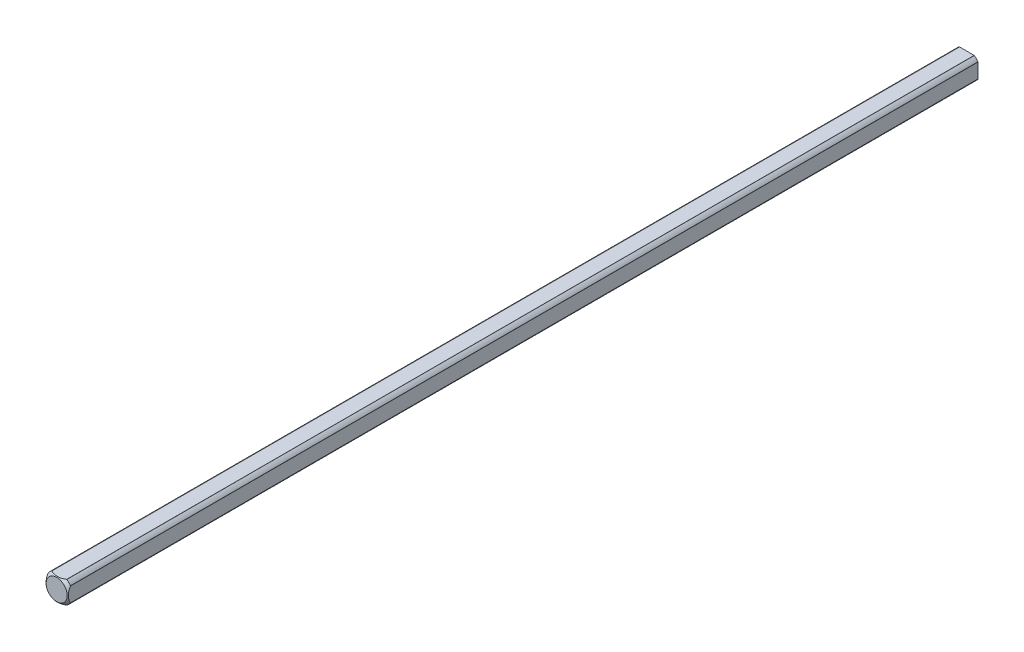
ISO-10303-21;
HEADER;
FILE_DESCRIPTION(('STEP AP214'),'2;1');
FILE_NAME('part.step','',(''),(''),'','','');
FILE_SCHEMA(('AUTOMOTIVE_DESIGN { 1 0 10303 214 1 1 1 1 }'));
ENDSEC;
DATA;
#1=APPLICATION_CONTEXT('core data for automotive mechanical design processes');
#2=APPLICATION_PROTOCOL_DEFINITION('international standard','automotive_design',2000,#1);
#3=PRODUCT_CONTEXT('',#1,'mechanical');
#4=PRODUCT('Part','Part','',(#3));
#5=PRODUCT_RELATED_PRODUCT_CATEGORY('part','',(#4));
#6=PRODUCT_DEFINITION_FORMATION('','',#4);
#7=PRODUCT_DEFINITION_CONTEXT('part definition',#1,'design');
#8=PRODUCT_DEFINITION('design','',#6,#7);
#9=PRODUCT_DEFINITION_SHAPE('','',#8);
#10=(LENGTH_UNIT() NAMED_UNIT(*) SI_UNIT(.MILLI.,.METRE.));
#11=(NAMED_UNIT(*) PLANE_ANGLE_UNIT() SI_UNIT($,.RADIAN.));
#12=(NAMED_UNIT(*) SI_UNIT($,.STERADIAN.) SOLID_ANGLE_UNIT());
#13=UNCERTAINTY_MEASURE_WITH_UNIT(LENGTH_MEASURE(1.E-05),#10,'distance_accuracy_value','');
#14=(GEOMETRIC_REPRESENTATION_CONTEXT(3) GLOBAL_UNCERTAINTY_ASSIGNED_CONTEXT((#13)) GLOBAL_UNIT_ASSIGNED_CONTEXT((#10,
#11,#12)) REPRESENTATION_CONTEXT('',''));
#15=CARTESIAN_POINT('',(0.,0.,0.));
#16=DIRECTION('',(0.,0.,1.));
#17=DIRECTION('',(1.,0.,0.));
#18=AXIS2_PLACEMENT_3D('',#15,#16,#17);
#19=CARTESIAN_POINT('',(28.7535475568245,43.3190804876236,256.196800890026));
#20=DIRECTION('',(0.,1.,0.));
#21=DIRECTION('',(1.,0.,0.));
#22=AXIS2_PLACEMENT_3D('',#19,#20,#21);
#23=SPHERICAL_SURFACE('',#22,5.);
#24=CARTESIAN_POINT('',(25.5785475568245,43.3190804876236,256.196800890026));
#25=DIRECTION('',(1.,0.,0.));
#26=DIRECTION('',(0.,0.,-1.));
#27=AXIS2_PLACEMENT_3D('',#24,#25,#26);
#28=CIRCLE('',#27,3.86256067913504);
#29=CARTESIAN_POINT('',(25.5785475568245,45.3864907033282,259.459497627389));
#30=VERTEX_POINT('',#29);
#31=CARTESIAN_POINT('',(25.5785475568245,43.3190804876236,260.059361569161));
#32=VERTEX_POINT('',#31);
#33=EDGE_CURVE('E51',#30,#32,#28,.T.);
#34=ORIENTED_EDGE('',*,*,#33,.T.);
#35=CARTESIAN_POINT('',(28.7535475568245,43.3190804876236,256.196800890026));
#36=DIRECTION('',(0.,1.,0.));
#37=DIRECTION('',(-1.,0.,0.));
#38=AXIS2_PLACEMENT_3D('',#35,#36,#37);
#39=CIRCLE('',#38,5.);
#40=CARTESIAN_POINT('',(25.7535475568245,43.3190804876236,260.196800890026));
#41=VERTEX_POINT('',#40);
#42=EDGE_CURVE('E71',#32,#41,#39,.T.);
#43=ORIENTED_EDGE('',*,*,#42,.T.);
#44=CARTESIAN_POINT('',(28.7535475568245,43.3190804876236,260.196800890026));
#45=DIRECTION('',(0.,0.,1.));
#46=DIRECTION('',(1.,0.,0.));
#47=AXIS2_PLACEMENT_3D('',#44,#45,#46);
#48=CIRCLE('',#47,3.);
#49=CARTESIAN_POINT('',(31.7535475568245,43.3190804876236,260.196800890026));
#50=VERTEX_POINT('',#49);
#51=EDGE_CURVE('E430',#50,#41,#48,.T.);
#52=ORIENTED_EDGE('',*,*,#51,.F.);
#53=CARTESIAN_POINT('',(28.7535475568245,43.3190804876236,256.196800890026));
#54=DIRECTION('',(0.,-1.,0.));
#55=DIRECTION('',(0.,0.,-1.));
#56=AXIS2_PLACEMENT_3D('',#53,#54,#55);
#57=CIRCLE('',#56,5.);
#58=CARTESIAN_POINT('',(31.9285475568245,43.3190804876236,260.059361569161));
#59=VERTEX_POINT('',#58);
#60=EDGE_CURVE('E236',#59,#50,#57,.T.);
#61=ORIENTED_EDGE('',*,*,#60,.F.);
#62=CARTESIAN_POINT('',(31.9285475568245,43.3190804876236,256.196800890026));
#63=DIRECTION('',(-1.,0.,0.));
#64=DIRECTION('',(0.,0.,1.));
#65=AXIS2_PLACEMENT_3D('',#62,#63,#64);
#66=CIRCLE('',#65,3.86256067913504);
#67=CARTESIAN_POINT('',(31.9285475568245,45.3864907033282,259.459497627389));
#68=VERTEX_POINT('',#67);
#69=EDGE_CURVE('E377',#59,#68,#66,.T.);
#70=ORIENTED_EDGE('',*,*,#69,.T.);
#71=CARTESIAN_POINT('',(31.9066510051003,45.4577807107663,259.434686002256));
#72=CARTESIAN_POINT('',(31.9075078005275,45.4565176724769,259.434685928989));
#73=CARTESIAN_POINT('',(31.9083416590292,45.4552391600304,259.434718472174));
#74=CARTESIAN_POINT('',(31.9099665116627,45.4526471764855,259.434847776251));
#75=CARTESIAN_POINT('',(31.9107572050904,45.4513335367559,259.434944937507));
#76=CARTESIAN_POINT('',(31.9122940546831,45.448672646835,259.435203454448));
#77=CARTESIAN_POINT('',(31.9130398065263,45.4473252124042,259.435365314641));
#78=CARTESIAN_POINT('',(31.9144852671077,45.4445981686378,259.435753105404));
#79=CARTESIAN_POINT('',(31.9151844664741,45.4432183747466,259.435979634748));
#80=CARTESIAN_POINT('',(31.9165353203589,45.4404281081938,259.436496678883));
#81=CARTESIAN_POINT('',(31.9171863604332,45.4390174650019,259.436787876514));
#82=CARTESIAN_POINT('',(31.9184394438435,45.436167064375,259.437434175205));
#83=CARTESIAN_POINT('',(31.9190407704591,45.434727163666,259.437790031756));
#84=CARTESIAN_POINT('',(31.9201930145184,45.4318198796802,259.438565580029));
#85=CARTESIAN_POINT('',(31.9207431177512,45.4303523921039,259.438986088167));
#86=CARTESIAN_POINT('',(31.921791547355,45.4273916345701,259.439890882635));
#87=CARTESIAN_POINT('',(31.9222889686091,45.425898309321,259.440376034533));
#88=CARTESIAN_POINT('',(31.9232307128414,45.4228876458044,259.44141007143));
#89=CARTESIAN_POINT('',(31.9236740477385,45.4213703095016,259.441959859738));
#90=CARTESIAN_POINT('',(31.9245063472057,45.4183134630802,259.443123135607));
#91=CARTESIAN_POINT('',(31.9248942496571,45.4167740186513,259.443737553436));
#92=CARTESIAN_POINT('',(31.925614464728,45.4136748655876,259.445030064964));
#93=CARTESIAN_POINT('',(31.9259456507314,45.4121152911381,259.445709105947));
#94=CARTESIAN_POINT('',(31.9265512695634,45.4089778576026,259.447130850375));
#95=CARTESIAN_POINT('',(31.9268245211068,45.4074002043924,259.447874509168));
#96=CARTESIAN_POINT('',(31.9273131678021,45.4042286648182,259.449425483091));
#97=CARTESIAN_POINT('',(31.9275273368391,45.4026350578618,259.450233753706));
#98=CARTESIAN_POINT('',(31.9278967794103,45.3994337251356,259.451913957764));
#99=CARTESIAN_POINT('',(31.9280507916219,45.397826352775,259.452786840106));
#100=CARTESIAN_POINT('',(31.9282989506169,45.3945996977676,259.454596261006));
#101=CARTESIAN_POINT('',(31.9283918101211,45.3929808426428,259.455533735711));
#102=CARTESIAN_POINT('',(31.9285167646294,45.3897333988621,259.457472415343));
#103=CARTESIAN_POINT('',(31.9285475550807,45.3881053085549,259.458474540453));
#104=CARTESIAN_POINT('',(31.9285475568245,45.3864907033282,259.459497627389));
#105=B_SPLINE_CURVE_WITH_KNOTS('',3,(#71,#72,#73,#74,#75,#76,#77,#78,#79,#80,#81,#82,#83,#84,
#85,#86,#87,#88,#89,#90,#91,#92,#93,#94,#95,#96,#97,#98,#99,#100,#101,#102,#103,#104),
.UNSPECIFIED.,.F.,.F.,(4,2,2,2,2,2,2,2,2,2,2,2,2,2,2,2,4),(0.,0.00457797688055672,
0.00918458579630476,0.0138278395700054,0.0185155631142393,0.0232553611013212,0.0280545906640062,
0.032920339355959,0.0378594083742456,0.0428783008509084,0.0479832148661545,0.0531800407238063,
0.0584743619609931,0.0638714595328926,0.0693763186141383,0.0749936374824722,0.0807278379924127),.UNSPECIFIED.);
#106=CARTESIAN_POINT('',(31.9066510051003,45.4577807107663,259.434686002256));
#107=VERTEX_POINT('',#106);
#108=EDGE_CURVE('E363',#107,#68,#105,.T.);
#109=ORIENTED_EDGE('',*,*,#108,.F.);
#110=CARTESIAN_POINT('',(28.7535475568245,43.3190804876236,259.434686002256));
#111=DIRECTION('',(0.,0.,1.));
#112=DIRECTION('',(-1.,0.,0.));
#113=AXIS2_PLACEMENT_3D('',#110,#111,#112);
#114=CIRCLE('',#113,3.81);
#115=CARTESIAN_POINT('',(30.8922477799672,46.4721839358994,259.434686002256));
#116=VERTEX_POINT('',#115);
#117=EDGE_CURVE('E372',#107,#116,#114,.T.);
#118=ORIENTED_EDGE('',*,*,#117,.T.);
#119=CARTESIAN_POINT('',(30.8209577725291,46.4940804876236,259.459497627389));
#120=CARTESIAN_POINT('',(30.8225723777558,46.4940804858798,259.458474540453));
#121=CARTESIAN_POINT('',(30.824200468063,46.4940496954285,259.457472415343));
#122=CARTESIAN_POINT('',(30.8274479118437,46.4939247409202,259.455533735711));
#123=CARTESIAN_POINT('',(30.8290667669686,46.493831881416,259.454596261006));
#124=CARTESIAN_POINT('',(30.832293421976,46.493583722421,259.452786840106));
#125=CARTESIAN_POINT('',(30.8339007943366,46.4934297102094,259.451913957764));
#126=CARTESIAN_POINT('',(30.8371021270628,46.4930602676382,259.450233753706));
#127=CARTESIAN_POINT('',(30.8386957340192,46.4928460986012,259.449425483091));
#128=CARTESIAN_POINT('',(30.8418672735935,46.4923574519059,259.447874509168));
#129=CARTESIAN_POINT('',(30.8434449268037,46.4920842003625,259.447130850375));
#130=CARTESIAN_POINT('',(30.8465823603392,46.4914785815305,259.445709105947));
#131=CARTESIAN_POINT('',(30.8481419347887,46.4911473955271,259.445030064964));
#132=CARTESIAN_POINT('',(30.8512410878524,46.4904271804562,259.443737553436));
#133=CARTESIAN_POINT('',(30.8527805322813,46.4900392780048,259.443123135607));
#134=CARTESIAN_POINT('',(30.8558373787027,46.4892069785376,259.441959859738));
#135=CARTESIAN_POINT('',(30.8573547150055,46.4887636436404,259.44141007143));
#136=CARTESIAN_POINT('',(30.8603653785221,46.4878218994081,259.440376034533));
#137=CARTESIAN_POINT('',(30.8618587037712,46.4873244781541,259.439890882635));
#138=CARTESIAN_POINT('',(30.864819461305,46.4862760485502,259.438986088167));
#139=CARTESIAN_POINT('',(30.8662869488813,46.4857259453174,259.438565580029));
#140=CARTESIAN_POINT('',(30.8691942328671,46.4845737012581,259.437790031756));
#141=CARTESIAN_POINT('',(30.870634133576,46.4839723746426,259.437434175205));
#142=CARTESIAN_POINT('',(30.8734845342029,46.4827192912322,259.436787876514));
#143=CARTESIAN_POINT('',(30.8748951773948,46.4820682511579,259.436496678883));
#144=CARTESIAN_POINT('',(30.8776854439476,46.4807173972732,259.435979634748));
#145=CARTESIAN_POINT('',(30.8790652378388,46.4800181979067,259.435753105404));
#146=CARTESIAN_POINT('',(30.8817922816052,46.4785727373254,259.435365314641));
#147=CARTESIAN_POINT('',(30.883139716036,46.4778269854821,259.435203454448));
#148=CARTESIAN_POINT('',(30.8858006059569,46.4762901358895,259.434944937507));
#149=CARTESIAN_POINT('',(30.8871142456865,46.4754994424618,259.434847776251));
#150=CARTESIAN_POINT('',(30.8897062292313,46.4738745898283,259.434718472174));
#151=CARTESIAN_POINT('',(30.8909847416778,46.4730407313266,259.434685928989));
#152=CARTESIAN_POINT('',(30.8922477799672,46.4721839358994,259.434686002256));
#153=B_SPLINE_CURVE_WITH_KNOTS('',3,(#119,#120,#121,#122,#123,#124,#125,#126,#127,#128,#129,
#130,#131,#132,#133,#134,#135,#136,#137,#138,#139,#140,#141,#142,#143,#144,#145,#146,#147,#148,
#149,#150,#151,#152),.UNSPECIFIED.,.F.,.F.,(4,2,2,2,2,2,2,2,2,2,2,2,2,2,2,2,4),(0.,
0.00573420050998488,0.0113515193783518,0.0168563784596285,0.0222534760315572,0.0275477972687607,
0.0327446231264275,0.0378495371416878,0.0428684296183512,0.0478074986366314,0.0526732473285772,
0.0574724768912435,0.0622122748783008,0.0668999984225071,0.0715432521961739,0.0761498611118691,
0.0807278379923825),.UNSPECIFIED.);
#154=CARTESIAN_POINT('',(30.8209577725291,46.4940804876236,259.459497627389));
#155=VERTEX_POINT('',#154);
#156=EDGE_CURVE('E367',#155,#116,#153,.T.);
#157=ORIENTED_EDGE('',*,*,#156,.F.);
#158=CARTESIAN_POINT('',(28.7535475568245,46.4940804876236,256.196800890026));
#159=DIRECTION('',(0.,-1.,0.));
#160=DIRECTION('',(0.,0.,-1.));
#161=AXIS2_PLACEMENT_3D('',#158,#159,#160);
#162=CIRCLE('',#161,3.86256067913504);
#163=CARTESIAN_POINT('',(26.6861373411198,46.4940804876236,259.459497627389));
#164=VERTEX_POINT('',#163);
#165=EDGE_CURVE('E316',#155,#164,#162,.T.);
#166=ORIENTED_EDGE('',*,*,#165,.T.);
#167=CARTESIAN_POINT('',(26.6148473336817,46.4721839358994,259.434686002256));
#168=CARTESIAN_POINT('',(26.6161103719712,46.4730407313266,259.434685928989));
#169=CARTESIAN_POINT('',(26.6173888844177,46.4738745898283,259.434718472174));
#170=CARTESIAN_POINT('',(26.6199808679625,46.4754994424618,259.434847776251));
#171=CARTESIAN_POINT('',(26.6212945076921,46.4762901358895,259.434944937507));
#172=CARTESIAN_POINT('',(26.6239553976131,46.4778269854822,259.435203454448));
#173=CARTESIAN_POINT('',(26.6253028320439,46.4785727373254,259.435365314641));
#174=CARTESIAN_POINT('',(26.6280298758102,46.4800181979068,259.435753105404));
#175=CARTESIAN_POINT('',(26.6294096697014,46.4807173972732,259.435979634748));
#176=CARTESIAN_POINT('',(26.6321999362543,46.482068251158,259.436496678883));
#177=CARTESIAN_POINT('',(26.6336105794462,46.4827192912323,259.436787876514));
#178=CARTESIAN_POINT('',(26.6364609800731,46.4839723746426,259.437434175205));
#179=CARTESIAN_POINT('',(26.637900880782,46.4845737012582,259.437790031756));
#180=CARTESIAN_POINT('',(26.6408081647679,46.4857259453175,259.438565580029));
#181=CARTESIAN_POINT('',(26.6422756523441,46.4862760485503,259.438986088167));
#182=CARTESIAN_POINT('',(26.6452364098779,46.4873244781541,259.439890882635));
#183=CARTESIAN_POINT('',(26.646729735127,46.4878218994082,259.440376034533));
#184=CARTESIAN_POINT('',(26.6497403986436,46.4887636436405,259.44141007143));
#185=CARTESIAN_POINT('',(26.6512577349464,46.4892069785376,259.441959859738));
#186=CARTESIAN_POINT('',(26.6543145813678,46.4900392780048,259.443123135607));
#187=CARTESIAN_POINT('',(26.6558540257967,46.4904271804562,259.443737553436));
#188=CARTESIAN_POINT('',(26.6589531788605,46.4911473955271,259.445030064964));
#189=CARTESIAN_POINT('',(26.6605127533099,46.4914785815305,259.445709105947));
#190=CARTESIAN_POINT('',(26.6636501868454,46.4920842003625,259.447130850375));
#191=CARTESIAN_POINT('',(26.6652278400556,46.4923574519059,259.447874509168));
#192=CARTESIAN_POINT('',(26.6683993796299,46.4928460986012,259.449425483091));
#193=CARTESIAN_POINT('',(26.6699929865863,46.4930602676382,259.450233753706));
#194=CARTESIAN_POINT('',(26.6731943193124,46.4934297102094,259.451913957764));
#195=CARTESIAN_POINT('',(26.674801691673,46.493583722421,259.452786840106));
#196=CARTESIAN_POINT('',(26.6780283466805,46.493831881416,259.454596261006));
#197=CARTESIAN_POINT('',(26.6796472018053,46.4939247409202,259.455533735711));
#198=CARTESIAN_POINT('',(26.682894645586,46.4940496954285,259.457472415343));
#199=CARTESIAN_POINT('',(26.6845227358931,46.4940804858798,259.458474540453));
#200=CARTESIAN_POINT('',(26.6861373411198,46.4940804876236,259.459497627389));
#201=B_SPLINE_CURVE_WITH_KNOTS('',3,(#167,#168,#169,#170,#171,#172,#173,#174,#175,#176,#177,
#178,#179,#180,#181,#182,#183,#184,#185,#186,#187,#188,#189,#190,#191,#192,#193,#194,#195,#196,
#197,#198,#199,#200),.UNSPECIFIED.,.F.,.F.,(4,2,2,2,2,2,2,2,2,2,2,2,2,2,2,2,4),(0.,
0.00457797688055963,0.0091845857963047,0.0138278395700054,0.0185155631142423,0.0232553611013211,
0.0280545906640061,0.0329203393559589,0.0378594083742455,0.0428783008509052,0.0479832148661544,
0.0531800407238093,0.0584743619609899,0.0638714595328956,0.0693763186141382,0.0749936374824691,
0.0807278379924126),.UNSPECIFIED.);
#202=CARTESIAN_POINT('',(26.6148473336817,46.4721839358994,259.434686002256));
#203=VERTEX_POINT('',#202);
#204=EDGE_CURVE('E350',#203,#164,#201,.T.);
#205=ORIENTED_EDGE('',*,*,#204,.F.);
#206=CARTESIAN_POINT('',(28.7535475568245,43.3190804876236,259.434686002256));
#207=DIRECTION('',(0.,0.,1.));
#208=DIRECTION('',(-1.,0.,0.));
#209=AXIS2_PLACEMENT_3D('',#206,#207,#208);
#210=CIRCLE('',#209,3.81);
#211=CARTESIAN_POINT('',(25.6004441085485,45.4577807107662,259.434686002256));
#212=VERTEX_POINT('',#211);
#213=EDGE_CURVE('E307',#203,#212,#210,.T.);
#214=ORIENTED_EDGE('',*,*,#213,.T.);
#215=CARTESIAN_POINT('',(25.5785475568245,45.3864907033282,259.459497627389));
#216=CARTESIAN_POINT('',(25.5785475585682,45.3881053085549,259.458474540453));
#217=CARTESIAN_POINT('',(25.5785783490195,45.3897333988621,259.457472415343));
#218=CARTESIAN_POINT('',(25.5787033035278,45.3929808426428,259.455533735711));
#219=CARTESIAN_POINT('',(25.578796163032,45.3945996977677,259.454596261006));
#220=CARTESIAN_POINT('',(25.5790443220271,45.3978263527751,259.452786840106));
#221=CARTESIAN_POINT('',(25.5791983342387,45.3994337251357,259.451913957764));
#222=CARTESIAN_POINT('',(25.5795677768098,45.4026350578619,259.450233753706));
#223=CARTESIAN_POINT('',(25.5797819458469,45.4042286648183,259.449425483091));
#224=CARTESIAN_POINT('',(25.5802705925422,45.4074002043926,259.447874509168));
#225=CARTESIAN_POINT('',(25.5805438440855,45.4089778576028,259.447130850375));
#226=CARTESIAN_POINT('',(25.5811494629176,45.4121152911383,259.445709105947));
#227=CARTESIAN_POINT('',(25.581480648921,45.4136748655878,259.445030064964));
#228=CARTESIAN_POINT('',(25.5822008639918,45.4167740186515,259.443737553436));
#229=CARTESIAN_POINT('',(25.5825887664433,45.4183134630804,259.443123135607));
#230=CARTESIAN_POINT('',(25.5834210659104,45.4213703095018,259.441959859738));
#231=CARTESIAN_POINT('',(25.5838644008076,45.4228876458046,259.44141007143));
#232=CARTESIAN_POINT('',(25.5848061450399,45.4258983093212,259.440376034533));
#233=CARTESIAN_POINT('',(25.5853035662939,45.4273916345703,259.439890882635));
#234=CARTESIAN_POINT('',(25.5863519958978,45.4303523921041,259.438986088167));
#235=CARTESIAN_POINT('',(25.5869020991306,45.4318198796803,259.438565580029));
#236=CARTESIAN_POINT('',(25.5880543431899,45.4347271636661,259.437790031756));
#237=CARTESIAN_POINT('',(25.5886556698055,45.4361670643751,259.437434175205));
#238=CARTESIAN_POINT('',(25.5899087532158,45.439017465002,259.436787876514));
#239=CARTESIAN_POINT('',(25.5905597932901,45.4404281081938,259.436496678883));
#240=CARTESIAN_POINT('',(25.5919106471748,45.4432183747467,259.435979634748));
#241=CARTESIAN_POINT('',(25.5926098465413,45.4445981686378,259.435753105404));
#242=CARTESIAN_POINT('',(25.5940553071226,45.4473252124042,259.435365314641));
#243=CARTESIAN_POINT('',(25.5948010589658,45.448672646835,259.435203454448));
#244=CARTESIAN_POINT('',(25.5963379085585,45.4513335367559,259.434944937507));
#245=CARTESIAN_POINT('',(25.5971286019862,45.4526471764855,259.434847776251));
#246=CARTESIAN_POINT('',(25.5987534546196,45.4552391600303,259.434718472174));
#247=CARTESIAN_POINT('',(25.5995873131214,45.4565176724768,259.434685928989));
#248=CARTESIAN_POINT('',(25.6004441085485,45.4577807107662,259.434686002256));
#249=B_SPLINE_CURVE_WITH_KNOTS('',3,(#215,#216,#217,#218,#219,#220,#221,#222,#223,#224,#225,
#226,#227,#228,#229,#230,#231,#232,#233,#234,#235,#236,#237,#238,#239,#240,#241,#242,#243,#244,
#245,#246,#247,#248),.UNSPECIFIED.,.F.,.F.,(4,2,2,2,2,2,2,2,2,2,2,2,2,2,2,2,4),(0.,
0.00573420050998772,0.0113515193783518,0.0168563784596288,0.0222534760315602,0.0275477972687538,
0.0327446231264207,0.0378495371416731,0.042868429618327,0.0478074986365999,0.0526732473285351,
0.0574724768911926,0.0622122748782301,0.0668999984224195,0.0715432521960706,0.0761498611117533,
0.0807278379922427),.UNSPECIFIED.);
#250=EDGE_CURVE('E184',#30,#212,#249,.T.);
#251=ORIENTED_EDGE('',*,*,#250,.F.);
#252=EDGE_LOOP('',(#34,#43,#52,#61,#70,#109,#118,#157,#166,#205,#214,#251));
#253=FACE_BOUND('',#252,.T.);
#254=ADVANCED_FACE('F40',(#253),#23,.T.);
#255=CARTESIAN_POINT('',(28.7535475568245,43.3190804876236,260.196800890026));
#256=DIRECTION('',(0.,0.,-1.));
#257=DIRECTION('',(-1.,0.,0.));
#258=AXIS2_PLACEMENT_3D('',#255,#256,#257);
#259=CYLINDRICAL_SURFACE('',#258,3.81);
#260=CARTESIAN_POINT('',(28.7535475568245,43.3190804876236,1.37080089002584));
#261=DIRECTION('',(0.,0.,1.));
#262=DIRECTION('',(1.,0.,0.));
#263=AXIS2_PLACEMENT_3D('',#260,#261,#262);
#264=CIRCLE('',#263,3.81);
#265=CARTESIAN_POINT('',(31.9066510051003,41.1803802644808,1.37080089002584));
#266=VERTEX_POINT('',#265);
#267=CARTESIAN_POINT('',(30.8922477799672,40.1659770393477,1.37080089002584));
#268=VERTEX_POINT('',#267);
#269=EDGE_CURVE('E58',#266,#268,#264,.F.);
#270=ORIENTED_EDGE('',*,*,#269,.F.);
#271=DIRECTION('',(0.,0.,1.));
#272=VECTOR('',#271,1.);
#273=CARTESIAN_POINT('',(31.9066510051003,41.1803802644808,260.196800890026));
#274=LINE('',#273,#272);
#275=CARTESIAN_POINT('',(31.9066510051003,41.1803802644808,259.434686002256));
#276=VERTEX_POINT('',#275);
#277=EDGE_CURVE('E440',#266,#276,#274,.T.);
#278=ORIENTED_EDGE('',*,*,#277,.T.);
#279=CARTESIAN_POINT('',(28.7535475568245,43.3190804876236,259.434686002256));
#280=DIRECTION('',(0.,0.,1.));
#281=DIRECTION('',(-1.,0.,0.));
#282=AXIS2_PLACEMENT_3D('',#279,#280,#281);
#283=CIRCLE('',#282,3.81);
#284=CARTESIAN_POINT('',(30.8922477799672,40.1659770393477,259.434686002256));
#285=VERTEX_POINT('',#284);
#286=EDGE_CURVE('E235',#285,#276,#283,.T.);
#287=ORIENTED_EDGE('',*,*,#286,.F.);
#288=DIRECTION('',(0.,0.,-1.));
#289=VECTOR('',#288,1.);
#290=CARTESIAN_POINT('',(30.8922477799672,40.1659770393477,260.196800890026));
#291=LINE('',#290,#289);
#292=EDGE_CURVE('E317',#285,#268,#291,.T.);
#293=ORIENTED_EDGE('',*,*,#292,.T.);
#294=EDGE_LOOP('',(#270,#278,#287,#293));
#295=FACE_BOUND('',#294,.T.);
#296=ADVANCED_FACE('F274',(#295),#259,.T.);
#297=CARTESIAN_POINT('',(31.9285475568245,45.4251372294992,260.196800890026));
#298=DIRECTION('',(-1.,0.,0.));
#299=DIRECTION('',(0.,0.,1.));
#300=AXIS2_PLACEMENT_3D('',#297,#298,#299);
#301=PLANE('',#300);
#302=DIRECTION('',(0.,0.,-1.));
#303=VECTOR('',#302,1.);
#304=CARTESIAN_POINT('',(31.9285475568245,41.2516702719189,260.196800890026));
#305=LINE('',#304,#303);
#306=CARTESIAN_POINT('',(31.9285475568245,41.2516702719189,259.459497627389));
#307=VERTEX_POINT('',#306);
#308=CARTESIAN_POINT('',(31.9285475568245,41.2516702719189,1.37080089002584));
#309=VERTEX_POINT('',#308);
#310=EDGE_CURVE('E339',#307,#309,#305,.T.);
#311=ORIENTED_EDGE('',*,*,#310,.T.);
#312=DIRECTION('',(0.,1.,0.));
#313=VECTOR('',#312,1.);
#314=CARTESIAN_POINT('',(31.9285475568245,45.4251372294992,1.37080089002584));
#315=LINE('',#314,#313);
#316=CARTESIAN_POINT('',(31.9285475568245,45.3864907033282,1.37080089002584));
#317=VERTEX_POINT('',#316);
#318=EDGE_CURVE('E621',#309,#317,#315,.T.);
#319=ORIENTED_EDGE('',*,*,#318,.T.);
#320=DIRECTION('',(0.,0.,1.));
#321=VECTOR('',#320,1.);
#322=CARTESIAN_POINT('',(31.9285475568245,45.3864907033282,260.196800890026));
#323=LINE('',#322,#321);
#324=EDGE_CURVE('E337',#317,#68,#323,.T.);
#325=ORIENTED_EDGE('',*,*,#324,.T.);
#326=ORIENTED_EDGE('',*,*,#69,.F.);
#327=CARTESIAN_POINT('',(31.9285475568245,43.3190804876236,256.196800890026));
#328=DIRECTION('',(-1.,0.,0.));
#329=DIRECTION('',(0.,0.,1.));
#330=AXIS2_PLACEMENT_3D('',#327,#328,#329);
#331=CIRCLE('',#330,3.86256067913504);
#332=EDGE_CURVE('E226',#307,#59,#331,.T.);
#333=ORIENTED_EDGE('',*,*,#332,.F.);
#334=EDGE_LOOP('',(#311,#319,#325,#326,#333));
#335=FACE_BOUND('',#334,.T.);
#336=ADVANCED_FACE('F280',(#335),#301,.F.);
#337=CARTESIAN_POINT('',(28.7535475568245,43.3190804876236,260.196800890026));
#338=DIRECTION('',(0.,0.,-1.));
#339=DIRECTION('',(-1.,0.,0.));
#340=AXIS2_PLACEMENT_3D('',#337,#338,#339);
#341=CYLINDRICAL_SURFACE('',#340,3.81);
#342=CARTESIAN_POINT('',(28.7535475568245,43.3190804876236,1.37080089002584));
#343=DIRECTION('',(0.,0.,1.));
#344=DIRECTION('',(1.,0.,0.));
#345=AXIS2_PLACEMENT_3D('',#342,#343,#344);
#346=CIRCLE('',#345,3.81);
#347=CARTESIAN_POINT('',(30.8922477799672,46.4721839358994,1.37080089002584));
#348=VERTEX_POINT('',#347);
#349=CARTESIAN_POINT('',(31.9066510051003,45.4577807107663,1.37080089002584));
#350=VERTEX_POINT('',#349);
#351=EDGE_CURVE('E610',#348,#350,#346,.F.);
#352=ORIENTED_EDGE('',*,*,#351,.F.);
#353=DIRECTION('',(0.,0.,1.));
#354=VECTOR('',#353,1.);
#355=CARTESIAN_POINT('',(30.8922477799672,46.4721839358994,260.196800890026));
#356=LINE('',#355,#354);
#357=EDGE_CURVE('E45',#348,#116,#356,.T.);
#358=ORIENTED_EDGE('',*,*,#357,.T.);
#359=ORIENTED_EDGE('',*,*,#117,.F.);
#360=DIRECTION('',(0.,0.,-1.));
#361=VECTOR('',#360,1.);
#362=CARTESIAN_POINT('',(31.9066510051003,45.4577807107663,260.196800890026));
#363=LINE('',#362,#361);
#364=EDGE_CURVE('E340',#107,#350,#363,.T.);
#365=ORIENTED_EDGE('',*,*,#364,.T.);
#366=EDGE_LOOP('',(#352,#358,#359,#365));
#367=FACE_BOUND('',#366,.T.);
#368=ADVANCED_FACE('F407',(#367),#341,.T.);
#369=CARTESIAN_POINT('',(26.6474908149488,46.4940804876236,260.196800890026));
#370=DIRECTION('',(0.,-1.,0.));
#371=DIRECTION('',(0.,0.,-1.));
#372=AXIS2_PLACEMENT_3D('',#369,#370,#371);
#373=PLANE('',#372);
#374=DIRECTION('',(0.,0.,-1.));
#375=VECTOR('',#374,1.);
#376=CARTESIAN_POINT('',(30.8209577725291,46.4940804876236,260.196800890026));
#377=LINE('',#376,#375);
#378=CARTESIAN_POINT('',(30.8209577725291,46.4940804876236,1.37080089002585));
#379=VERTEX_POINT('',#378);
#380=EDGE_CURVE('E334',#155,#379,#377,.T.);
#381=ORIENTED_EDGE('',*,*,#380,.T.);
#382=DIRECTION('',(1.,0.,0.));
#383=VECTOR('',#382,1.);
#384=CARTESIAN_POINT('',(35.2579350506452,46.4940804876236,1.37080089002584));
#385=LINE('',#384,#383);
#386=CARTESIAN_POINT('',(26.6861373411198,46.4940804876236,1.37080089002585));
#387=VERTEX_POINT('',#386);
#388=EDGE_CURVE('E633',#387,#379,#385,.T.);
#389=ORIENTED_EDGE('',*,*,#388,.F.);
#390=DIRECTION('',(0.,0.,1.));
#391=VECTOR('',#390,1.);
#392=CARTESIAN_POINT('',(26.6861373411198,46.4940804876236,260.196800890026));
#393=LINE('',#392,#391);
#394=EDGE_CURVE('E324',#387,#164,#393,.T.);
#395=ORIENTED_EDGE('',*,*,#394,.T.);
#396=ORIENTED_EDGE('',*,*,#165,.F.);
#397=EDGE_LOOP('',(#381,#389,#395,#396));
#398=FACE_BOUND('',#397,.T.);
#399=ADVANCED_FACE('F208',(#398),#373,.F.);
#400=CARTESIAN_POINT('',(28.7535475568245,43.3190804876236,260.196800890026));
#401=DIRECTION('',(0.,0.,-1.));
#402=DIRECTION('',(-1.,0.,0.));
#403=AXIS2_PLACEMENT_3D('',#400,#401,#402);
#404=CYLINDRICAL_SURFACE('',#403,3.81);
#405=CARTESIAN_POINT('',(28.7535475568245,43.3190804876236,1.37080089002584));
#406=DIRECTION('',(0.,0.,1.));
#407=DIRECTION('',(1.,0.,0.));
#408=AXIS2_PLACEMENT_3D('',#405,#406,#407);
#409=CIRCLE('',#408,3.81);
#410=CARTESIAN_POINT('',(25.6004441085486,45.4577807107663,1.37080089002584));
#411=VERTEX_POINT('',#410);
#412=CARTESIAN_POINT('',(26.6148473336817,46.4721839358994,1.37080089002584));
#413=VERTEX_POINT('',#412);
#414=EDGE_CURVE('E577',#411,#413,#409,.F.);
#415=ORIENTED_EDGE('',*,*,#414,.F.);
#416=DIRECTION('',(0.,0.,1.));
#417=VECTOR('',#416,1.);
#418=CARTESIAN_POINT('',(25.6004441085486,45.4577807107663,260.196800890026));
#419=LINE('',#418,#417);
#420=EDGE_CURVE('E325',#411,#212,#419,.T.);
#421=ORIENTED_EDGE('',*,*,#420,.T.);
#422=ORIENTED_EDGE('',*,*,#213,.F.);
#423=DIRECTION('',(0.,0.,-1.));
#424=VECTOR('',#423,1.);
#425=CARTESIAN_POINT('',(26.6148473336817,46.4721839358994,260.196800890026));
#426=LINE('',#425,#424);
#427=EDGE_CURVE('E320',#203,#413,#426,.T.);
#428=ORIENTED_EDGE('',*,*,#427,.T.);
#429=EDGE_LOOP('',(#415,#421,#422,#428));
#430=FACE_BOUND('',#429,.T.);
#431=ADVANCED_FACE('F285',(#430),#404,.T.);
#432=CARTESIAN_POINT('',(25.5785475568245,45.4251372294992,260.196800890026));
#433=DIRECTION('',(1.,0.,0.));
#434=DIRECTION('',(0.,1.,0.));
#435=AXIS2_PLACEMENT_3D('',#432,#433,#434);
#436=PLANE('',#435);
#437=DIRECTION('',(0.,0.,-1.));
#438=VECTOR('',#437,1.);
#439=CARTESIAN_POINT('',(25.5785475568245,45.3864907033282,260.196800890026));
#440=LINE('',#439,#438);
#441=CARTESIAN_POINT('',(25.5785475568245,45.3864907033282,1.37080089002584));
#442=VERTEX_POINT('',#441);
#443=EDGE_CURVE('E592',#30,#442,#440,.T.);
#444=ORIENTED_EDGE('',*,*,#443,.T.);
#445=DIRECTION('',(0.,-1.,0.));
#446=VECTOR('',#445,1.);
#447=CARTESIAN_POINT('',(25.5785475568245,45.4251372294992,1.37080089002584));
#448=LINE('',#447,#446);
#449=CARTESIAN_POINT('',(25.5785475568245,41.2516702719189,1.37080089002584));
#450=VERTEX_POINT('',#449);
#451=EDGE_CURVE('E609',#442,#450,#448,.T.);
#452=ORIENTED_EDGE('',*,*,#451,.T.);
#453=DIRECTION('',(0.,0.,1.));
#454=VECTOR('',#453,1.);
#455=CARTESIAN_POINT('',(25.5785475568245,41.2516702719189,260.196800890026));
#456=LINE('',#455,#454);
#457=CARTESIAN_POINT('',(25.5785475568245,41.2516702719189,259.459497627389));
#458=VERTEX_POINT('',#457);
#459=EDGE_CURVE('E178',#450,#458,#456,.T.);
#460=ORIENTED_EDGE('',*,*,#459,.T.);
#461=CARTESIAN_POINT('',(25.5785475568245,43.3190804876236,256.196800890026));
#462=DIRECTION('',(1.,0.,0.));
#463=DIRECTION('',(0.,0.,-1.));
#464=AXIS2_PLACEMENT_3D('',#461,#462,#463);
#465=CIRCLE('',#464,3.86256067913504);
#466=EDGE_CURVE('E165',#32,#458,#465,.T.);
#467=ORIENTED_EDGE('',*,*,#466,.F.);
#468=ORIENTED_EDGE('',*,*,#33,.F.);
#469=EDGE_LOOP('',(#444,#452,#460,#467,#468));
#470=FACE_BOUND('',#469,.T.);
#471=ADVANCED_FACE('F590',(#470),#436,.F.);
#472=CARTESIAN_POINT('',(28.7535475568245,43.3190804876236,260.196800890026));
#473=DIRECTION('',(0.,0.,-1.));
#474=DIRECTION('',(-1.,0.,0.));
#475=AXIS2_PLACEMENT_3D('',#472,#473,#474);
#476=CYLINDRICAL_SURFACE('',#475,3.81);
#477=CARTESIAN_POINT('',(28.7535475568245,43.3190804876236,1.37080089002584));
#478=DIRECTION('',(0.,0.,1.));
#479=DIRECTION('',(1.,0.,0.));
#480=AXIS2_PLACEMENT_3D('',#477,#478,#479);
#481=CIRCLE('',#480,3.81);
#482=CARTESIAN_POINT('',(26.6148473336817,40.1659770393477,1.37080089002584));
#483=VERTEX_POINT('',#482);
#484=CARTESIAN_POINT('',(25.6004441085486,41.1803802644808,1.37080089002584));
#485=VERTEX_POINT('',#484);
#486=EDGE_CURVE('E623',#483,#485,#481,.F.);
#487=ORIENTED_EDGE('',*,*,#486,.F.);
#488=DIRECTION('',(0.,0.,1.));
#489=VECTOR('',#488,1.);
#490=CARTESIAN_POINT('',(26.6148473336817,40.1659770393477,260.196800890026));
#491=LINE('',#490,#489);
#492=CARTESIAN_POINT('',(26.6148473336818,40.1659770393476,259.434686002256));
#493=VERTEX_POINT('',#492);
#494=EDGE_CURVE('E160',#483,#493,#491,.T.);
#495=ORIENTED_EDGE('',*,*,#494,.T.);
#496=CARTESIAN_POINT('',(28.7535475568245,43.3190804876236,259.434686002256));
#497=DIRECTION('',(0.,0.,1.));
#498=DIRECTION('',(-1.,0.,0.));
#499=AXIS2_PLACEMENT_3D('',#496,#497,#498);
#500=CIRCLE('',#499,3.81);
#501=CARTESIAN_POINT('',(25.6004441085486,41.1803802644808,259.434686002256));
#502=VERTEX_POINT('',#501);
#503=EDGE_CURVE('E153',#502,#493,#500,.T.);
#504=ORIENTED_EDGE('',*,*,#503,.F.);
#505=DIRECTION('',(0.,0.,-1.));
#506=VECTOR('',#505,1.);
#507=CARTESIAN_POINT('',(25.6004441085486,41.1803802644808,260.196800890026));
#508=LINE('',#507,#506);
#509=EDGE_CURVE('E158',#502,#485,#508,.T.);
#510=ORIENTED_EDGE('',*,*,#509,.T.);
#511=EDGE_LOOP('',(#487,#495,#504,#510));
#512=FACE_BOUND('',#511,.T.);
#513=ADVANCED_FACE('F156',(#512),#476,.T.);
#514=CARTESIAN_POINT('',(26.6474908149488,40.1440804876236,260.196800890026));
#515=DIRECTION('',(0.,1.,0.));
#516=DIRECTION('',(1.,0.,0.));
#517=AXIS2_PLACEMENT_3D('',#514,#515,#516);
#518=PLANE('',#517);
#519=DIRECTION('',(0.,0.,-1.));
#520=VECTOR('',#519,1.);
#521=CARTESIAN_POINT('',(26.6861373411198,40.1440804876236,260.196800890026));
#522=LINE('',#521,#520);
#523=CARTESIAN_POINT('',(26.6861373411198,40.1440804876236,259.459497627389));
#524=VERTEX_POINT('',#523);
#525=CARTESIAN_POINT('',(26.6861373411198,40.1440804876236,1.37080089002584));
#526=VERTEX_POINT('',#525);
#527=EDGE_CURVE('E450',#524,#526,#522,.T.);
#528=ORIENTED_EDGE('',*,*,#527,.T.);
#529=DIRECTION('',(1.,0.,0.));
#530=VECTOR('',#529,1.);
#531=CARTESIAN_POINT('',(26.6474908149486,40.1440804876236,1.37080089002584));
#532=LINE('',#531,#530);
#533=CARTESIAN_POINT('',(30.8209577725291,40.1440804876236,1.37080089002584));
#534=VERTEX_POINT('',#533);
#535=EDGE_CURVE('E539',#526,#534,#532,.T.);
#536=ORIENTED_EDGE('',*,*,#535,.T.);
#537=DIRECTION('',(0.,0.,1.));
#538=VECTOR('',#537,1.);
#539=CARTESIAN_POINT('',(30.8209577725291,40.1440804876236,260.196800890026));
#540=LINE('',#539,#538);
#541=CARTESIAN_POINT('',(30.8209577725291,40.1440804876236,259.459497627389));
#542=VERTEX_POINT('',#541);
#543=EDGE_CURVE('E517',#534,#542,#540,.T.);
#544=ORIENTED_EDGE('',*,*,#543,.T.);
#545=CARTESIAN_POINT('',(28.7535475568245,40.1440804876236,256.196800890026));
#546=DIRECTION('',(0.,1.,0.));
#547=DIRECTION('',(0.,0.,1.));
#548=AXIS2_PLACEMENT_3D('',#545,#546,#547);
#549=CIRCLE('',#548,3.86256067913504);
#550=EDGE_CURVE('E166',#524,#542,#549,.T.);
#551=ORIENTED_EDGE('',*,*,#550,.F.);
#552=EDGE_LOOP('',(#528,#536,#544,#551));
#553=FACE_BOUND('',#552,.T.);
#554=ADVANCED_FACE('F206',(#553),#518,.F.);
#555=CARTESIAN_POINT('',(30.8209577725291,46.3670804876236,260.196800890026));
#556=DIRECTION('',(0.,0.,-1.));
#557=DIRECTION('',(-1.,0.,0.));
#558=AXIS2_PLACEMENT_3D('',#555,#556,#557);
#559=CYLINDRICAL_SURFACE('',#558,0.127);
#560=CARTESIAN_POINT('',(30.8209577725291,46.3670804876236,1.37080089002584));
#561=DIRECTION('',(0.,0.,1.));
#562=DIRECTION('',(1.,0.,0.));
#563=AXIS2_PLACEMENT_3D('',#560,#561,#562);
#564=CIRCLE('',#563,0.127);
#565=EDGE_CURVE('E581',#379,#348,#564,.F.);
#566=ORIENTED_EDGE('',*,*,#565,.F.);
#567=ORIENTED_EDGE('',*,*,#380,.F.);
#568=ORIENTED_EDGE('',*,*,#156,.T.);
#569=ORIENTED_EDGE('',*,*,#357,.F.);
#570=EDGE_LOOP('',(#566,#567,#568,#569));
#571=FACE_BOUND('',#570,.T.);
#572=ADVANCED_FACE('F465',(#571),#559,.T.);
#573=CARTESIAN_POINT('',(31.8015475568245,45.3864907033282,260.196800890026));
#574=DIRECTION('',(0.,0.,-1.));
#575=DIRECTION('',(-1.,0.,0.));
#576=AXIS2_PLACEMENT_3D('',#573,#574,#575);
#577=CYLINDRICAL_SURFACE('',#576,0.127);
#578=CARTESIAN_POINT('',(31.8015475568245,45.3864907033282,1.37080089002584));
#579=DIRECTION('',(0.,0.,1.));
#580=DIRECTION('',(1.,0.,0.));
#581=AXIS2_PLACEMENT_3D('',#578,#579,#580);
#582=CIRCLE('',#581,0.127);
#583=EDGE_CURVE('E412',#350,#317,#582,.F.);
#584=ORIENTED_EDGE('',*,*,#583,.F.);
#585=ORIENTED_EDGE('',*,*,#364,.F.);
#586=ORIENTED_EDGE('',*,*,#108,.T.);
#587=ORIENTED_EDGE('',*,*,#324,.F.);
#588=EDGE_LOOP('',(#584,#585,#586,#587));
#589=FACE_BOUND('',#588,.T.);
#590=ADVANCED_FACE('F264',(#589),#577,.T.);
#591=CARTESIAN_POINT('',(26.6861373411198,46.3670804876236,260.196800890026));
#592=DIRECTION('',(0.,0.,-1.));
#593=DIRECTION('',(-1.,0.,0.));
#594=AXIS2_PLACEMENT_3D('',#591,#592,#593);
#595=CYLINDRICAL_SURFACE('',#594,0.127);
#596=CARTESIAN_POINT('',(26.6861373411198,46.3670804876236,1.37080089002584));
#597=DIRECTION('',(0.,0.,1.));
#598=DIRECTION('',(1.,0.,0.));
#599=AXIS2_PLACEMENT_3D('',#596,#597,#598);
#600=CIRCLE('',#599,0.127);
#601=EDGE_CURVE('E436',#413,#387,#600,.F.);
#602=ORIENTED_EDGE('',*,*,#601,.F.);
#603=ORIENTED_EDGE('',*,*,#427,.F.);
#604=ORIENTED_EDGE('',*,*,#204,.T.);
#605=ORIENTED_EDGE('',*,*,#394,.F.);
#606=EDGE_LOOP('',(#602,#603,#604,#605));
#607=FACE_BOUND('',#606,.T.);
#608=ADVANCED_FACE('F42',(#607),#595,.T.);
#609=CARTESIAN_POINT('',(25.7055475568245,45.3864907033282,260.196800890026));
#610=DIRECTION('',(0.,0.,-1.));
#611=DIRECTION('',(-1.,0.,0.));
#612=AXIS2_PLACEMENT_3D('',#609,#610,#611);
#613=CYLINDRICAL_SURFACE('',#612,0.127);
#614=CARTESIAN_POINT('',(25.7055475568245,45.3864907033282,1.37080089002584));
#615=DIRECTION('',(0.,0.,1.));
#616=DIRECTION('',(1.,0.,0.));
#617=AXIS2_PLACEMENT_3D('',#614,#615,#616);
#618=CIRCLE('',#617,0.127);
#619=EDGE_CURVE('E574',#442,#411,#618,.F.);
#620=ORIENTED_EDGE('',*,*,#619,.F.);
#621=ORIENTED_EDGE('',*,*,#443,.F.);
#622=ORIENTED_EDGE('',*,*,#250,.T.);
#623=ORIENTED_EDGE('',*,*,#420,.F.);
#624=EDGE_LOOP('',(#620,#621,#622,#623));
#625=FACE_BOUND('',#624,.T.);
#626=ADVANCED_FACE('F593',(#625),#613,.T.);
#627=CARTESIAN_POINT('',(25.7055475568245,41.2516702719189,260.196800890026));
#628=DIRECTION('',(0.,0.,-1.));
#629=DIRECTION('',(-1.,0.,0.));
#630=AXIS2_PLACEMENT_3D('',#627,#628,#629);
#631=CYLINDRICAL_SURFACE('',#630,0.127);
#632=CARTESIAN_POINT('',(25.7055475568245,41.2516702719189,1.37080089002584));
#633=DIRECTION('',(0.,0.,1.));
#634=DIRECTION('',(1.,0.,0.));
#635=AXIS2_PLACEMENT_3D('',#632,#633,#634);
#636=CIRCLE('',#635,0.127);
#637=EDGE_CURVE('E176',#485,#450,#636,.F.);
#638=ORIENTED_EDGE('',*,*,#637,.F.);
#639=ORIENTED_EDGE('',*,*,#509,.F.);
#640=CARTESIAN_POINT('',(25.6004441085486,41.1803802644808,259.434686002256));
#641=CARTESIAN_POINT('',(25.5995873131214,41.1816433027703,259.434685928989));
#642=CARTESIAN_POINT('',(25.5987534546197,41.1829218152167,259.434718472174));
#643=CARTESIAN_POINT('',(25.5971286019862,41.1855137987616,259.434847776251));
#644=CARTESIAN_POINT('',(25.5963379085585,41.1868274384912,259.434944937507));
#645=CARTESIAN_POINT('',(25.5948010589659,41.1894883284121,259.435203454448));
#646=CARTESIAN_POINT('',(25.5940553071226,41.1908357628429,259.435365314641));
#647=CARTESIAN_POINT('',(25.5926098465413,41.1935628066093,259.435753105404));
#648=CARTESIAN_POINT('',(25.5919106471748,41.1949426005005,259.435979634748));
#649=CARTESIAN_POINT('',(25.5905597932901,41.1977328670533,259.436496678883));
#650=CARTESIAN_POINT('',(25.5899087532158,41.1991435102453,259.436787876514));
#651=CARTESIAN_POINT('',(25.5886556698054,41.2019939108721,259.437434175205));
#652=CARTESIAN_POINT('',(25.5880543431899,41.2034338115811,259.437790031756));
#653=CARTESIAN_POINT('',(25.5869020991306,41.2063410955669,259.438565580029));
#654=CARTESIAN_POINT('',(25.5863519958978,41.2078085831432,259.438986088167));
#655=CARTESIAN_POINT('',(25.5853035662939,41.210769340677,259.439890882635));
#656=CARTESIAN_POINT('',(25.5848061450398,41.2122626659261,259.440376034533));
#657=CARTESIAN_POINT('',(25.5838644008076,41.2152733294427,259.44141007143));
#658=CARTESIAN_POINT('',(25.5834210659104,41.2167906657455,259.441959859738));
#659=CARTESIAN_POINT('',(25.5825887664432,41.2198475121669,259.443123135607));
#660=CARTESIAN_POINT('',(25.5822008639918,41.2213869565958,259.443737553436));
#661=CARTESIAN_POINT('',(25.5814806489209,41.2244861096595,259.445030064964));
#662=CARTESIAN_POINT('',(25.5811494629176,41.226045684109,259.445709105947));
#663=CARTESIAN_POINT('',(25.5805438440855,41.2291831176445,259.447130850375));
#664=CARTESIAN_POINT('',(25.5802705925421,41.2307607708547,259.447874509168));
#665=CARTESIAN_POINT('',(25.5797819458468,41.2339323104289,259.449425483091));
#666=CARTESIAN_POINT('',(25.5795677768098,41.2355259173853,259.450233753706));
#667=CARTESIAN_POINT('',(25.5791983342387,41.2387272501115,259.451913957764));
#668=CARTESIAN_POINT('',(25.579044322027,41.2403346224721,259.452786840106));
#669=CARTESIAN_POINT('',(25.578796163032,41.2435612774795,259.454596261006));
#670=CARTESIAN_POINT('',(25.5787033035278,41.2451801326043,259.455533735711));
#671=CARTESIAN_POINT('',(25.5785783490195,41.2484275763851,259.457472415343));
#672=CARTESIAN_POINT('',(25.5785475585682,41.2500556666922,259.458474540453));
#673=CARTESIAN_POINT('',(25.5785475568245,41.2516702719189,259.459497627389));
#674=B_SPLINE_CURVE_WITH_KNOTS('',3,(#640,#641,#642,#643,#644,#645,#646,#647,#648,#649,#650,
#651,#652,#653,#654,#655,#656,#657,#658,#659,#660,#661,#662,#663,#664,#665,#666,#667,#668,#669,
#670,#671,#672,#673),.UNSPECIFIED.,.F.,.F.,(4,2,2,2,2,2,2,2,2,2,2,2,2,2,2,2,4),(0.,
0.00457797688054902,0.00918458579628162,0.0138278395699746,0.0185155631142069,
0.0232553611012811,0.02805459066396,0.0329203393559151,0.0378594083741943,0.042878300850859,
0.0479832148661114,0.0531800407237638,0.0584743619609569,0.0638714595328629,0.069376318614115,
0.0749936374824547,0.080727837992407),.UNSPECIFIED.);
#675=EDGE_CURVE('E173',#502,#458,#674,.T.);
#676=ORIENTED_EDGE('',*,*,#675,.T.);
#677=ORIENTED_EDGE('',*,*,#459,.F.);
#678=EDGE_LOOP('',(#638,#639,#676,#677));
#679=FACE_BOUND('',#678,.T.);
#680=ADVANCED_FACE('F171',(#679),#631,.T.);
#681=CARTESIAN_POINT('',(26.6861373411198,40.2710804876236,260.196800890026));
#682=DIRECTION('',(0.,0.,-1.));
#683=DIRECTION('',(-1.,0.,0.));
#684=AXIS2_PLACEMENT_3D('',#681,#682,#683);
#685=CYLINDRICAL_SURFACE('',#684,0.127);
#686=CARTESIAN_POINT('',(26.6861373411198,40.2710804876236,1.37080089002584));
#687=DIRECTION('',(0.,0.,1.));
#688=DIRECTION('',(1.,0.,0.));
#689=AXIS2_PLACEMENT_3D('',#686,#687,#688);
#690=CIRCLE('',#689,0.127);
#691=EDGE_CURVE('E625',#526,#483,#690,.F.);
#692=ORIENTED_EDGE('',*,*,#691,.F.);
#693=ORIENTED_EDGE('',*,*,#527,.F.);
#694=CARTESIAN_POINT('',(26.6861373411198,40.1440804876236,259.459497627389));
#695=CARTESIAN_POINT('',(26.6845227358931,40.1440804893673,259.458474540453));
#696=CARTESIAN_POINT('',(26.682894645586,40.1441112798186,259.457472415343));
#697=CARTESIAN_POINT('',(26.6796472018052,40.1442362343269,259.455533735711));
#698=CARTESIAN_POINT('',(26.6780283466804,40.1443290938311,259.454596261006));
#699=CARTESIAN_POINT('',(26.6748016916729,40.1445772528262,259.452786840106));
#700=CARTESIAN_POINT('',(26.6731943193123,40.1447312650378,259.451913957764));
#701=CARTESIAN_POINT('',(26.6699929865861,40.1451007076089,259.450233753706));
#702=CARTESIAN_POINT('',(26.6683993796297,40.145314876646,259.449425483091));
#703=CARTESIAN_POINT('',(26.6652278400555,40.1458035233413,259.447874509168));
#704=CARTESIAN_POINT('',(26.6636501868452,40.1460767748846,259.447130850375));
#705=CARTESIAN_POINT('',(26.6605127533098,40.1466823937167,259.445709105947));
#706=CARTESIAN_POINT('',(26.6589531788603,40.1470135797201,259.445030064964));
#707=CARTESIAN_POINT('',(26.6558540257965,40.1477337947909,259.443737553436));
#708=CARTESIAN_POINT('',(26.6543145813676,40.1481216972424,259.443123135607));
#709=CARTESIAN_POINT('',(26.6512577349463,40.1489539967095,259.441959859738));
#710=CARTESIAN_POINT('',(26.6497403986434,40.1493973316067,259.44141007143));
#711=CARTESIAN_POINT('',(26.6467297351268,40.150339075839,259.440376034533));
#712=CARTESIAN_POINT('',(26.6452364098778,40.1508364970931,259.439890882635));
#713=CARTESIAN_POINT('',(26.642275652344,40.1518849266969,259.438986088167));
#714=CARTESIAN_POINT('',(26.6408081647677,40.1524350299297,259.438565580029));
#715=CARTESIAN_POINT('',(26.6379008807819,40.153587273989,259.437790031756));
#716=CARTESIAN_POINT('',(26.636460980073,40.1541886006046,259.437434175205));
#717=CARTESIAN_POINT('',(26.6336105794461,40.1554416840149,259.436787876514));
#718=CARTESIAN_POINT('',(26.6321999362542,40.1560927240892,259.436496678883));
#719=CARTESIAN_POINT('',(26.6294096697014,40.1574435779739,259.435979634748));
#720=CARTESIAN_POINT('',(26.6280298758102,40.1581427773404,259.435753105404));
#721=CARTESIAN_POINT('',(26.6253028320439,40.1595882379217,259.435365314641));
#722=CARTESIAN_POINT('',(26.6239553976131,40.1603339897649,259.435203454448));
#723=CARTESIAN_POINT('',(26.6212945076921,40.1618708393576,259.434944937507));
#724=CARTESIAN_POINT('',(26.6199808679626,40.1626615327853,259.434847776251));
#725=CARTESIAN_POINT('',(26.6173888844177,40.1642863854187,259.434718472174));
#726=CARTESIAN_POINT('',(26.6161103719713,40.1651202439205,259.434685928989));
#727=CARTESIAN_POINT('',(26.6148473336818,40.1659770393476,259.434686002256));
#728=B_SPLINE_CURVE_WITH_KNOTS('',3,(#694,#695,#696,#697,#698,#699,#700,#701,#702,#703,#704,
#705,#706,#707,#708,#709,#710,#711,#712,#713,#714,#715,#716,#717,#718,#719,#720,#721,#722,#723,
#724,#725,#726,#727),.UNSPECIFIED.,.F.,.F.,(4,2,2,2,2,2,2,2,2,2,2,2,2,2,2,2,4),(0.,
0.00573420050998488,0.0113515193783518,0.0168563784596285,0.0222534760315572,0.0275477972687576,
0.0327446231264169,0.0378495371416709,0.0428684296183261,0.0478074986365969,0.052673247328534,
0.0574724768911884,0.0622122748782335,0.0668999984224245,0.0715432521960725,0.0761498611117553,
0.0807278379922428),.UNSPECIFIED.);
#729=EDGE_CURVE('E185',#524,#493,#728,.T.);
#730=ORIENTED_EDGE('',*,*,#729,.T.);
#731=ORIENTED_EDGE('',*,*,#494,.F.);
#732=EDGE_LOOP('',(#692,#693,#730,#731));
#733=FACE_BOUND('',#732,.T.);
#734=ADVANCED_FACE('F476',(#733),#685,.T.);
#735=CARTESIAN_POINT('',(31.8015475568245,41.2516702719189,260.196800890026));
#736=DIRECTION('',(0.,0.,-1.));
#737=DIRECTION('',(-1.,0.,0.));
#738=AXIS2_PLACEMENT_3D('',#735,#736,#737);
#739=CYLINDRICAL_SURFACE('',#738,0.127);
#740=CARTESIAN_POINT('',(31.8015475568245,41.2516702719189,1.37080089002584));
#741=DIRECTION('',(0.,0.,1.));
#742=DIRECTION('',(1.,0.,0.));
#743=AXIS2_PLACEMENT_3D('',#740,#741,#742);
#744=CIRCLE('',#743,0.127);
#745=EDGE_CURVE('E629',#309,#266,#744,.F.);
#746=ORIENTED_EDGE('',*,*,#745,.F.);
#747=ORIENTED_EDGE('',*,*,#310,.F.);
#748=CARTESIAN_POINT('',(31.9285475568245,41.2516702719189,259.459497627389));
#749=CARTESIAN_POINT('',(31.9285475550807,41.2500556666922,259.458474540453));
#750=CARTESIAN_POINT('',(31.9285167646294,41.248427576385,259.457472415343));
#751=CARTESIAN_POINT('',(31.9283918101211,41.2451801326043,259.455533735711));
#752=CARTESIAN_POINT('',(31.9282989506169,41.2435612774795,259.454596261006));
#753=CARTESIAN_POINT('',(31.9280507916219,41.240334622472,259.452786840106));
#754=CARTESIAN_POINT('',(31.9278967794102,41.2387272501114,259.451913957764));
#755=CARTESIAN_POINT('',(31.9275273368391,41.2355259173852,259.450233753706));
#756=CARTESIAN_POINT('',(31.9273131678021,41.2339323104288,259.449425483091));
#757=CARTESIAN_POINT('',(31.9268245211068,41.2307607708546,259.447874509168));
#758=CARTESIAN_POINT('',(31.9265512695634,41.2291831176443,259.447130850375));
#759=CARTESIAN_POINT('',(31.9259456507313,41.2260456841088,259.445709105947));
#760=CARTESIAN_POINT('',(31.925614464728,41.2244861096594,259.445030064964));
#761=CARTESIAN_POINT('',(31.9248942496571,41.2213869565956,259.443737553436));
#762=CARTESIAN_POINT('',(31.9245063472057,41.2198475121667,259.443123135607));
#763=CARTESIAN_POINT('',(31.9236740477385,41.2167906657453,259.441959859738));
#764=CARTESIAN_POINT('',(31.9232307128413,41.2152733294425,259.44141007143));
#765=CARTESIAN_POINT('',(31.922288968609,41.2122626659259,259.440376034533));
#766=CARTESIAN_POINT('',(31.921791547355,41.2107693406768,259.439890882635));
#767=CARTESIAN_POINT('',(31.9207431177511,41.207808583143,259.438986088167));
#768=CARTESIAN_POINT('',(31.9201930145183,41.2063410955668,259.438565580029));
#769=CARTESIAN_POINT('',(31.919040770459,41.203433811581,259.437790031756));
#770=CARTESIAN_POINT('',(31.9184394438434,41.201993910872,259.437434175205));
#771=CARTESIAN_POINT('',(31.9171863604331,41.1991435102451,259.436787876514));
#772=CARTESIAN_POINT('',(31.9165353203588,41.1977328670532,259.436496678883));
#773=CARTESIAN_POINT('',(31.9151844664741,41.1949426005004,259.435979634748));
#774=CARTESIAN_POINT('',(31.9144852671076,41.1935628066092,259.435753105404));
#775=CARTESIAN_POINT('',(31.9130398065263,41.1908357628429,259.435365314641));
#776=CARTESIAN_POINT('',(31.912294054683,41.1894883284121,259.435203454448));
#777=CARTESIAN_POINT('',(31.9107572050904,41.1868274384912,259.434944937507));
#778=CARTESIAN_POINT('',(31.9099665116627,41.1855137987615,259.434847776251));
#779=CARTESIAN_POINT('',(31.9083416590292,41.1829218152167,259.434718472174));
#780=CARTESIAN_POINT('',(31.9075078005275,41.1816433027702,259.434685928989));
#781=CARTESIAN_POINT('',(31.9066510051003,41.1803802644808,259.434686002256));
#782=B_SPLINE_CURVE_WITH_KNOTS('',3,(#748,#749,#750,#751,#752,#753,#754,#755,#756,#757,#758,
#759,#760,#761,#762,#763,#764,#765,#766,#767,#768,#769,#770,#771,#772,#773,#774,#775,#776,#777,
#778,#779,#780,#781),.UNSPECIFIED.,.F.,.F.,(4,2,2,2,2,2,2,2,2,2,2,2,2,2,2,2,4),(0.,
0.00573420050998192,0.0113515193783518,0.0168563784596285,0.0222534760315604,0.0275477972687607,
0.0327446231264276,0.0378495371416878,0.042868429618348,0.0478074986366283,0.0526732473285772,
0.0574724768912435,0.0622122748783039,0.0668999984225041,0.0715432521961739,0.0761498611118721,
0.0807278379923826),.UNSPECIFIED.);
#783=EDGE_CURVE('E494',#307,#276,#782,.T.);
#784=ORIENTED_EDGE('',*,*,#783,.T.);
#785=ORIENTED_EDGE('',*,*,#277,.F.);
#786=EDGE_LOOP('',(#746,#747,#784,#785));
#787=FACE_BOUND('',#786,.T.);
#788=ADVANCED_FACE('F263',(#787),#739,.T.);
#789=CARTESIAN_POINT('',(30.8209577725291,40.2710804876236,260.196800890026));
#790=DIRECTION('',(0.,0.,-1.));
#791=DIRECTION('',(-1.,0.,0.));
#792=AXIS2_PLACEMENT_3D('',#789,#790,#791);
#793=CYLINDRICAL_SURFACE('',#792,0.127);
#794=CARTESIAN_POINT('',(30.8209577725291,40.2710804876236,1.37080089002584));
#795=DIRECTION('',(0.,0.,1.));
#796=DIRECTION('',(1.,0.,0.));
#797=AXIS2_PLACEMENT_3D('',#794,#795,#796);
#798=CIRCLE('',#797,0.127);
#799=EDGE_CURVE('E11',#268,#534,#798,.F.);
#800=ORIENTED_EDGE('',*,*,#799,.F.);
#801=ORIENTED_EDGE('',*,*,#292,.F.);
#802=CARTESIAN_POINT('',(30.8922477799672,40.1659770393477,259.434686002256));
#803=CARTESIAN_POINT('',(30.8909847416778,40.1651202439205,259.434685928989));
#804=CARTESIAN_POINT('',(30.8897062292313,40.1642863854188,259.434718472174));
#805=CARTESIAN_POINT('',(30.8871142456864,40.1626615327853,259.434847776251));
#806=CARTESIAN_POINT('',(30.8858006059568,40.1618708393576,259.434944937507));
#807=CARTESIAN_POINT('',(30.8831397160359,40.1603339897649,259.435203454448));
#808=CARTESIAN_POINT('',(30.8817922816051,40.1595882379217,259.435365314641));
#809=CARTESIAN_POINT('',(30.8790652378387,40.1581427773404,259.435753105404));
#810=CARTESIAN_POINT('',(30.8776854439475,40.1574435779739,259.435979634748));
#811=CARTESIAN_POINT('',(30.8748951773947,40.1560927240892,259.436496678883));
#812=CARTESIAN_POINT('',(30.8734845342027,40.1554416840149,259.436787876514));
#813=CARTESIAN_POINT('',(30.8706341335758,40.1541886006045,259.437434175205));
#814=CARTESIAN_POINT('',(30.8691942328669,40.153587273989,259.437790031756));
#815=CARTESIAN_POINT('',(30.8662869488811,40.1524350299297,259.438565580029));
#816=CARTESIAN_POINT('',(30.8648194613048,40.1518849266969,259.438986088167));
#817=CARTESIAN_POINT('',(30.861858703771,40.150836497093,259.439890882635));
#818=CARTESIAN_POINT('',(30.8603653785219,40.1503390758389,259.440376034533));
#819=CARTESIAN_POINT('',(30.8573547150053,40.1493973316067,259.44141007143));
#820=CARTESIAN_POINT('',(30.8558373787025,40.1489539967095,259.441959859738));
#821=CARTESIAN_POINT('',(30.8527805322811,40.1481216972423,259.443123135607));
#822=CARTESIAN_POINT('',(30.8512410878522,40.1477337947909,259.443737553436));
#823=CARTESIAN_POINT('',(30.8481419347885,40.14701357972,259.445030064964));
#824=CARTESIAN_POINT('',(30.846582360339,40.1466823937167,259.445709105947));
#825=CARTESIAN_POINT('',(30.8434449268035,40.1460767748846,259.447130850375));
#826=CARTESIAN_POINT('',(30.8418672735933,40.1458035233412,259.447874509168));
#827=CARTESIAN_POINT('',(30.8386957340191,40.1453148766459,259.449425483091));
#828=CARTESIAN_POINT('',(30.8371021270627,40.1451007076089,259.450233753706));
#829=CARTESIAN_POINT('',(30.8339007943365,40.1447312650378,259.451913957764));
#830=CARTESIAN_POINT('',(30.8322934219759,40.1445772528261,259.452786840106));
#831=CARTESIAN_POINT('',(30.8290667669685,40.1443290938311,259.454596261006));
#832=CARTESIAN_POINT('',(30.8274479118437,40.1442362343269,259.455533735711));
#833=CARTESIAN_POINT('',(30.8242004680629,40.1441112798186,259.457472415343));
#834=CARTESIAN_POINT('',(30.8225723777558,40.1440804893673,259.458474540453));
#835=CARTESIAN_POINT('',(30.8209577725291,40.1440804876236,259.459497627389));
#836=B_SPLINE_CURVE_WITH_KNOTS('',3,(#802,#803,#804,#805,#806,#807,#808,#809,#810,#811,#812,
#813,#814,#815,#816,#817,#818,#819,#820,#821,#822,#823,#824,#825,#826,#827,#828,#829,#830,#831,
#832,#833,#834,#835),.UNSPECIFIED.,.F.,.F.,(4,2,2,2,2,2,2,2,2,2,2,2,2,2,2,2,4),(0.,
0.00457797688055963,0.0091845857963047,0.0138278395700084,0.0185155631142423,0.0232553611013241,
0.0280545906640092,0.0329203393559675,0.037859408374252,0.0428783008509103,0.0479832148661611,
0.0531800407238129,0.0584743619609935,0.0638714595328961,0.0693763186141418,0.0749936374824727,
0.0807278379924131),.UNSPECIFIED.);
#837=EDGE_CURVE('E250',#285,#542,#836,.T.);
#838=ORIENTED_EDGE('',*,*,#837,.T.);
#839=ORIENTED_EDGE('',*,*,#543,.F.);
#840=EDGE_LOOP('',(#800,#801,#838,#839));
#841=FACE_BOUND('',#840,.T.);
#842=ADVANCED_FACE('F205',(#841),#793,.T.);
#843=CARTESIAN_POINT('',(28.7535475568245,43.3190804876236,256.196800890026));
#844=DIRECTION('',(0.,1.,0.));
#845=DIRECTION('',(1.,0.,0.));
#846=AXIS2_PLACEMENT_3D('',#843,#844,#845);
#847=SPHERICAL_SURFACE('',#846,5.);
#848=ORIENTED_EDGE('',*,*,#42,.F.);
#849=ORIENTED_EDGE('',*,*,#466,.T.);
#850=ORIENTED_EDGE('',*,*,#675,.F.);
#851=ORIENTED_EDGE('',*,*,#503,.T.);
#852=ORIENTED_EDGE('',*,*,#729,.F.);
#853=ORIENTED_EDGE('',*,*,#550,.T.);
#854=ORIENTED_EDGE('',*,*,#837,.F.);
#855=ORIENTED_EDGE('',*,*,#286,.T.);
#856=ORIENTED_EDGE('',*,*,#783,.F.);
#857=ORIENTED_EDGE('',*,*,#332,.T.);
#858=ORIENTED_EDGE('',*,*,#60,.T.);
#859=CARTESIAN_POINT('',(28.7535475568245,43.3190804876236,260.196800890026));
#860=DIRECTION('',(0.,0.,1.));
#861=DIRECTION('',(1.,0.,0.));
#862=AXIS2_PLACEMENT_3D('',#859,#860,#861);
#863=CIRCLE('',#862,3.);
#864=EDGE_CURVE('E432',#41,#50,#863,.T.);
#865=ORIENTED_EDGE('',*,*,#864,.F.);
#866=EDGE_LOOP('',(#848,#849,#850,#851,#852,#853,#854,#855,#856,#857,#858,#865));
#867=FACE_BOUND('',#866,.T.);
#868=ADVANCED_FACE('F181',(#867),#847,.T.);
#869=CARTESIAN_POINT('',(28.7535475568245,43.3190804876236,260.196800890026));
#870=DIRECTION('',(0.,0.,1.));
#871=DIRECTION('',(1.,0.,0.));
#872=AXIS2_PLACEMENT_3D('',#869,#870,#871);
#873=PLANE('',#872);
#874=ORIENTED_EDGE('',*,*,#51,.T.);
#875=ORIENTED_EDGE('',*,*,#864,.T.);
#876=EDGE_LOOP('',(#874,#875));
#877=FACE_BOUND('',#876,.T.);
#878=ADVANCED_FACE('F204',(#877),#873,.T.);
#879=CARTESIAN_POINT('',(35.2579350506452,40.1415804876236,1.37080089002584));
#880=DIRECTION('',(0.,0.,1.));
#881=DIRECTION('',(1.,0.,0.));
#882=AXIS2_PLACEMENT_3D('',#879,#880,#881);
#883=PLANE('',#882);
#884=ORIENTED_EDGE('',*,*,#601,.T.);
#885=ORIENTED_EDGE('',*,*,#388,.T.);
#886=ORIENTED_EDGE('',*,*,#565,.T.);
#887=ORIENTED_EDGE('',*,*,#351,.T.);
#888=ORIENTED_EDGE('',*,*,#583,.T.);
#889=ORIENTED_EDGE('',*,*,#318,.F.);
#890=ORIENTED_EDGE('',*,*,#745,.T.);
#891=ORIENTED_EDGE('',*,*,#269,.T.);
#892=ORIENTED_EDGE('',*,*,#799,.T.);
#893=ORIENTED_EDGE('',*,*,#535,.F.);
#894=ORIENTED_EDGE('',*,*,#691,.T.);
#895=ORIENTED_EDGE('',*,*,#486,.T.);
#896=ORIENTED_EDGE('',*,*,#637,.T.);
#897=ORIENTED_EDGE('',*,*,#451,.F.);
#898=ORIENTED_EDGE('',*,*,#619,.T.);
#899=ORIENTED_EDGE('',*,*,#414,.T.);
#900=EDGE_LOOP('',(#884,#885,#886,#887,#888,#889,#890,#891,#892,#893,#894,#895,#896,#897,#898,#899));
#901=FACE_BOUND('',#900,.T.);
#902=ADVANCED_FACE('F268',(#901),#883,.F.);
#903=CLOSED_SHELL('',(#254,#296,#336,#368,#399,#431,#471,#513,#554,#572,#590,#608,#626,#680,
#734,#788,#842,#868,#878,#902));
#904=MANIFOLD_SOLID_BREP('B2',#903);
#905=ADVANCED_BREP_SHAPE_REPRESENTATION('',(#18,#904),#14);
#906=SHAPE_DEFINITION_REPRESENTATION(#9,#905);
ENDSEC;
END-ISO-10303-21;
